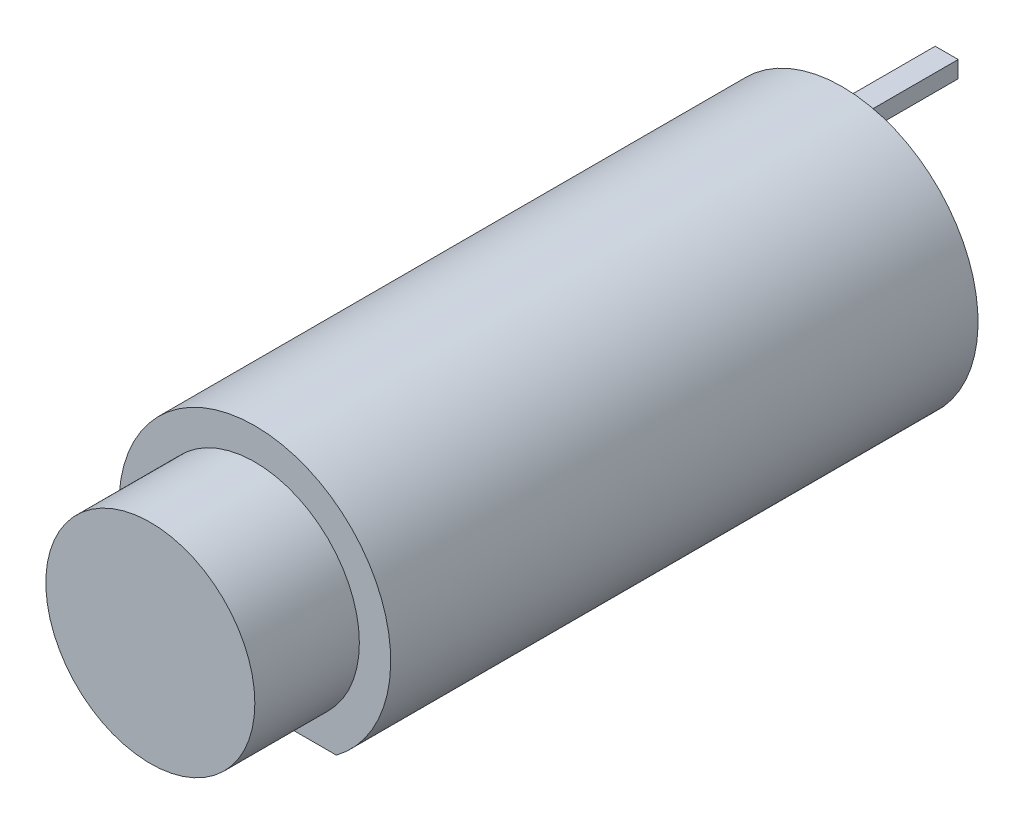
ISO-10303-21;
HEADER;
FILE_DESCRIPTION(('STEP AP214'),'2;1');
FILE_NAME('part.step','',(''),(''),'','','');
FILE_SCHEMA(('AUTOMOTIVE_DESIGN { 1 0 10303 214 1 1 1 1 }'));
ENDSEC;
DATA;
#1=APPLICATION_CONTEXT('core data for automotive mechanical design processes');
#2=APPLICATION_PROTOCOL_DEFINITION('international standard','automotive_design',2000,#1);
#3=PRODUCT_CONTEXT('',#1,'mechanical');
#4=PRODUCT('Part','Part','',(#3));
#5=PRODUCT_RELATED_PRODUCT_CATEGORY('part','',(#4));
#6=PRODUCT_DEFINITION_FORMATION('','',#4);
#7=PRODUCT_DEFINITION_CONTEXT('part definition',#1,'design');
#8=PRODUCT_DEFINITION('design','',#6,#7);
#9=PRODUCT_DEFINITION_SHAPE('','',#8);
#10=(LENGTH_UNIT() NAMED_UNIT(*) SI_UNIT(.MILLI.,.METRE.));
#11=(NAMED_UNIT(*) PLANE_ANGLE_UNIT() SI_UNIT($,.RADIAN.));
#12=(NAMED_UNIT(*) SI_UNIT($,.STERADIAN.) SOLID_ANGLE_UNIT());
#13=UNCERTAINTY_MEASURE_WITH_UNIT(LENGTH_MEASURE(1.E-05),#10,'distance_accuracy_value','');
#14=(GEOMETRIC_REPRESENTATION_CONTEXT(3) GLOBAL_UNCERTAINTY_ASSIGNED_CONTEXT((#13)) GLOBAL_UNIT_ASSIGNED_CONTEXT((#10,
#11,#12)) REPRESENTATION_CONTEXT('',''));
#15=CARTESIAN_POINT('',(0.,0.,0.));
#16=DIRECTION('',(0.,0.,1.));
#17=DIRECTION('',(1.,0.,0.));
#18=AXIS2_PLACEMENT_3D('',#15,#16,#17);
#19=CARTESIAN_POINT('',(0.,0.,33.1));
#20=DIRECTION('',(0.,0.,-1.));
#21=DIRECTION('',(-1.,0.,0.));
#22=AXIS2_PLACEMENT_3D('',#19,#20,#21);
#23=CYLINDRICAL_SURFACE('',#22,6.5);
#24=CARTESIAN_POINT('',(0.,0.,28.1));
#25=DIRECTION('',(0.,0.,1.));
#26=DIRECTION('',(1.,0.,0.));
#27=AXIS2_PLACEMENT_3D('',#24,#25,#26);
#28=CIRCLE('',#27,6.5);
#29=CARTESIAN_POINT('',(3.9,-5.2,28.1));
#30=VERTEX_POINT('',#29);
#31=CARTESIAN_POINT('',(-3.9,-5.2,28.1));
#32=VERTEX_POINT('',#31);
#33=EDGE_CURVE('E193',#30,#32,#28,.T.);
#34=ORIENTED_EDGE('',*,*,#33,.F.);
#35=DIRECTION('',(0.,0.,-1.));
#36=VECTOR('',#35,1.);
#37=CARTESIAN_POINT('',(3.9,-5.2,33.1));
#38=LINE('',#37,#36);
#39=CARTESIAN_POINT('',(3.9,-5.2,0.));
#40=VERTEX_POINT('',#39);
#41=EDGE_CURVE('E206',#30,#40,#38,.T.);
#42=ORIENTED_EDGE('',*,*,#41,.T.);
#43=CARTESIAN_POINT('',(0.,0.,0.));
#44=DIRECTION('',(0.,0.,1.));
#45=DIRECTION('',(1.,0.,0.));
#46=AXIS2_PLACEMENT_3D('',#43,#44,#45);
#47=CIRCLE('',#46,6.5);
#48=CARTESIAN_POINT('',(-3.9,-5.2,0.));
#49=VERTEX_POINT('',#48);
#50=EDGE_CURVE('E199',#40,#49,#47,.T.);
#51=ORIENTED_EDGE('',*,*,#50,.T.);
#52=DIRECTION('',(0.,0.,-1.));
#53=VECTOR('',#52,1.);
#54=CARTESIAN_POINT('',(-3.9,-5.2,33.1));
#55=LINE('',#54,#53);
#56=EDGE_CURVE('E42',#32,#49,#55,.T.);
#57=ORIENTED_EDGE('',*,*,#56,.F.);
#58=EDGE_LOOP('',(#34,#42,#51,#57));
#59=FACE_BOUND('',#58,.T.);
#60=ADVANCED_FACE('F35',(#59),#23,.T.);
#61=CARTESIAN_POINT('',(-3.9,-5.2,33.1));
#62=DIRECTION('',(0.,1.,0.));
#63=DIRECTION('',(0.,0.,1.));
#64=AXIS2_PLACEMENT_3D('',#61,#62,#63);
#65=PLANE('',#64);
#66=DIRECTION('',(1.,0.,0.));
#67=VECTOR('',#66,1.);
#68=CARTESIAN_POINT('',(-3.9,-5.2,28.1));
#69=LINE('',#68,#67);
#70=EDGE_CURVE('E197',#32,#30,#69,.T.);
#71=ORIENTED_EDGE('',*,*,#70,.F.);
#72=ORIENTED_EDGE('',*,*,#56,.T.);
#73=DIRECTION('',(1.,0.,0.));
#74=VECTOR('',#73,1.);
#75=CARTESIAN_POINT('',(-3.9,-5.2,0.));
#76=LINE('',#75,#74);
#77=CARTESIAN_POINT('',(-0.55,-5.2,0.));
#78=VERTEX_POINT('',#77);
#79=EDGE_CURVE('E203',#49,#78,#76,.T.);
#80=ORIENTED_EDGE('',*,*,#79,.T.);
#81=CARTESIAN_POINT('',(0.55,-5.2,0.));
#82=VERTEX_POINT('',#81);
#83=EDGE_CURVE('E207',#78,#82,#76,.T.);
#84=ORIENTED_EDGE('',*,*,#83,.T.);
#85=EDGE_CURVE('E202',#82,#40,#76,.T.);
#86=ORIENTED_EDGE('',*,*,#85,.T.);
#87=ORIENTED_EDGE('',*,*,#41,.F.);
#88=EDGE_LOOP('',(#71,#72,#80,#84,#86,#87));
#89=FACE_BOUND('',#88,.T.);
#90=ADVANCED_FACE('F213',(#89),#65,.F.);
#91=CARTESIAN_POINT('',(0.,0.,0.));
#92=DIRECTION('',(0.,0.,1.));
#93=DIRECTION('',(1.,0.,0.));
#94=AXIS2_PLACEMENT_3D('',#91,#92,#93);
#95=PLANE('',#94);
#96=DIRECTION('',(-1.,0.,0.));
#97=VECTOR('',#96,1.);
#98=CARTESIAN_POINT('',(-0.55,5.4,0.));
#99=LINE('',#98,#97);
#100=CARTESIAN_POINT('',(0.55,5.4,0.));
#101=VERTEX_POINT('',#100);
#102=CARTESIAN_POINT('',(-0.55,5.4,0.));
#103=VERTEX_POINT('',#102);
#104=EDGE_CURVE('E164',#101,#103,#99,.T.);
#105=ORIENTED_EDGE('',*,*,#104,.T.);
#106=DIRECTION('',(0.,-1.,0.));
#107=VECTOR('',#106,1.);
#108=CARTESIAN_POINT('',(-0.55,5.4,0.));
#109=LINE('',#108,#107);
#110=CARTESIAN_POINT('',(-0.55,4.6,0.));
#111=VERTEX_POINT('',#110);
#112=EDGE_CURVE('E156',#103,#111,#109,.T.);
#113=ORIENTED_EDGE('',*,*,#112,.T.);
#114=DIRECTION('',(1.,0.,0.));
#115=VECTOR('',#114,1.);
#116=CARTESIAN_POINT('',(-0.55,4.6,0.));
#117=LINE('',#116,#115);
#118=CARTESIAN_POINT('',(0.55,4.6,0.));
#119=VERTEX_POINT('',#118);
#120=EDGE_CURVE('E176',#111,#119,#117,.T.);
#121=ORIENTED_EDGE('',*,*,#120,.T.);
#122=DIRECTION('',(0.,1.,0.));
#123=VECTOR('',#122,1.);
#124=CARTESIAN_POINT('',(0.55,5.4,0.));
#125=LINE('',#124,#123);
#126=EDGE_CURVE('E57',#119,#101,#125,.T.);
#127=ORIENTED_EDGE('',*,*,#126,.T.);
#128=EDGE_LOOP('',(#105,#113,#121,#127));
#129=FACE_BOUND('',#128,.T.);
#130=DIRECTION('',(-1.,0.,0.));
#131=VECTOR('',#130,1.);
#132=CARTESIAN_POINT('',(-0.55,-4.6,0.));
#133=LINE('',#132,#131);
#134=CARTESIAN_POINT('',(0.55,-4.6,0.));
#135=VERTEX_POINT('',#134);
#136=CARTESIAN_POINT('',(-0.55,-4.6,0.));
#137=VERTEX_POINT('',#136);
#138=EDGE_CURVE('E49',#135,#137,#133,.T.);
#139=ORIENTED_EDGE('',*,*,#138,.T.);
#140=DIRECTION('',(0.,-1.,0.));
#141=VECTOR('',#140,1.);
#142=CARTESIAN_POINT('',(-0.55,-5.4,0.));
#143=LINE('',#142,#141);
#144=EDGE_CURVE('E143',#137,#78,#143,.T.);
#145=ORIENTED_EDGE('',*,*,#144,.T.);
#146=ORIENTED_EDGE('',*,*,#79,.F.);
#147=ORIENTED_EDGE('',*,*,#50,.F.);
#148=ORIENTED_EDGE('',*,*,#85,.F.);
#149=DIRECTION('',(0.,1.,0.));
#150=VECTOR('',#149,1.);
#151=CARTESIAN_POINT('',(0.55,0.,0.));
#152=LINE('',#151,#150);
#153=EDGE_CURVE('E11',#82,#135,#152,.T.);
#154=ORIENTED_EDGE('',*,*,#153,.T.);
#155=EDGE_LOOP('',(#139,#145,#146,#147,#148,#154));
#156=FACE_BOUND('',#155,.T.);
#157=ADVANCED_FACE('F220',(#129,#156),#95,.F.);
#158=CARTESIAN_POINT('',(0.,0.,28.1));
#159=DIRECTION('',(0.,0.,1.));
#160=DIRECTION('',(1.,0.,0.));
#161=AXIS2_PLACEMENT_3D('',#158,#159,#160);
#162=PLANE('',#161);
#163=CARTESIAN_POINT('',(0.,0.,28.1));
#164=DIRECTION('',(0.,0.,1.));
#165=DIRECTION('',(1.,0.,0.));
#166=AXIS2_PLACEMENT_3D('',#163,#164,#165);
#167=CIRCLE('',#166,5.);
#168=CARTESIAN_POINT('',(5.,0.,28.1));
#169=VERTEX_POINT('',#168);
#170=EDGE_CURVE('E190',#169,#169,#167,.T.);
#171=ORIENTED_EDGE('',*,*,#170,.F.);
#172=EDGE_LOOP('',(#171));
#173=FACE_BOUND('',#172,.T.);
#174=ORIENTED_EDGE('',*,*,#33,.T.);
#175=ORIENTED_EDGE('',*,*,#70,.T.);
#176=EDGE_LOOP('',(#174,#175));
#177=FACE_BOUND('',#176,.T.);
#178=ADVANCED_FACE('F244',(#173,#177),#162,.T.);
#179=CARTESIAN_POINT('',(0.,0.,28.1));
#180=DIRECTION('',(0.,0.,1.));
#181=DIRECTION('',(1.,0.,0.));
#182=AXIS2_PLACEMENT_3D('',#179,#180,#181);
#183=CYLINDRICAL_SURFACE('',#182,5.);
#184=ORIENTED_EDGE('',*,*,#170,.T.);
#185=EDGE_LOOP('',(#184));
#186=FACE_BOUND('',#185,.T.);
#187=CARTESIAN_POINT('',(0.,0.,33.1));
#188=DIRECTION('',(0.,0.,1.));
#189=DIRECTION('',(1.,0.,0.));
#190=AXIS2_PLACEMENT_3D('',#187,#188,#189);
#191=CIRCLE('',#190,5.);
#192=CARTESIAN_POINT('',(5.,0.,33.1));
#193=VERTEX_POINT('',#192);
#194=EDGE_CURVE('E184',#193,#193,#191,.T.);
#195=ORIENTED_EDGE('',*,*,#194,.F.);
#196=EDGE_LOOP('',(#195));
#197=FACE_BOUND('',#196,.T.);
#198=ADVANCED_FACE('F252',(#186,#197),#183,.T.);
#199=CARTESIAN_POINT('',(0.,0.,33.1));
#200=DIRECTION('',(0.,0.,1.));
#201=DIRECTION('',(1.,0.,0.));
#202=AXIS2_PLACEMENT_3D('',#199,#200,#201);
#203=PLANE('',#202);
#204=ORIENTED_EDGE('',*,*,#194,.T.);
#205=EDGE_LOOP('',(#204));
#206=FACE_BOUND('',#205,.T.);
#207=ADVANCED_FACE('F248',(#206),#203,.T.);
#208=CARTESIAN_POINT('',(-0.55,5.4,-5.));
#209=DIRECTION('',(-1.,0.,0.));
#210=DIRECTION('',(0.,0.,1.));
#211=AXIS2_PLACEMENT_3D('',#208,#209,#210);
#212=PLANE('',#211);
#213=ORIENTED_EDGE('',*,*,#112,.F.);
#214=DIRECTION('',(0.,0.,1.));
#215=VECTOR('',#214,1.);
#216=CARTESIAN_POINT('',(-0.55,5.4,-5.));
#217=LINE('',#216,#215);
#218=CARTESIAN_POINT('',(-0.55,5.4,-5.));
#219=VERTEX_POINT('',#218);
#220=EDGE_CURVE('E182',#219,#103,#217,.T.);
#221=ORIENTED_EDGE('',*,*,#220,.F.);
#222=DIRECTION('',(0.,-1.,0.));
#223=VECTOR('',#222,1.);
#224=CARTESIAN_POINT('',(-0.55,5.4,-5.));
#225=LINE('',#224,#223);
#226=CARTESIAN_POINT('',(-0.55,4.6,-5.));
#227=VERTEX_POINT('',#226);
#228=EDGE_CURVE('E160',#219,#227,#225,.T.);
#229=ORIENTED_EDGE('',*,*,#228,.T.);
#230=DIRECTION('',(0.,0.,1.));
#231=VECTOR('',#230,1.);
#232=CARTESIAN_POINT('',(-0.55,4.6,-5.));
#233=LINE('',#232,#231);
#234=EDGE_CURVE('E173',#227,#111,#233,.T.);
#235=ORIENTED_EDGE('',*,*,#234,.T.);
#236=EDGE_LOOP('',(#213,#221,#229,#235));
#237=FACE_BOUND('',#236,.T.);
#238=ADVANCED_FACE('F251',(#237),#212,.T.);
#239=CARTESIAN_POINT('',(-0.55,5.4,-5.));
#240=DIRECTION('',(0.,1.,0.));
#241=DIRECTION('',(0.,0.,1.));
#242=AXIS2_PLACEMENT_3D('',#239,#240,#241);
#243=PLANE('',#242);
#244=ORIENTED_EDGE('',*,*,#104,.F.);
#245=DIRECTION('',(0.,0.,1.));
#246=VECTOR('',#245,1.);
#247=CARTESIAN_POINT('',(0.55,5.4,-5.));
#248=LINE('',#247,#246);
#249=CARTESIAN_POINT('',(0.55,5.4,-5.));
#250=VERTEX_POINT('',#249);
#251=EDGE_CURVE('E185',#250,#101,#248,.T.);
#252=ORIENTED_EDGE('',*,*,#251,.F.);
#253=DIRECTION('',(-1.,0.,0.));
#254=VECTOR('',#253,1.);
#255=CARTESIAN_POINT('',(-0.55,5.4,-5.));
#256=LINE('',#255,#254);
#257=EDGE_CURVE('E170',#250,#219,#256,.T.);
#258=ORIENTED_EDGE('',*,*,#257,.T.);
#259=ORIENTED_EDGE('',*,*,#220,.T.);
#260=EDGE_LOOP('',(#244,#252,#258,#259));
#261=FACE_BOUND('',#260,.T.);
#262=ADVANCED_FACE('F262',(#261),#243,.T.);
#263=CARTESIAN_POINT('',(0.55,5.4,-5.));
#264=DIRECTION('',(1.,0.,0.));
#265=DIRECTION('',(0.,0.,-1.));
#266=AXIS2_PLACEMENT_3D('',#263,#264,#265);
#267=PLANE('',#266);
#268=ORIENTED_EDGE('',*,*,#126,.F.);
#269=DIRECTION('',(0.,0.,1.));
#270=VECTOR('',#269,1.);
#271=CARTESIAN_POINT('',(0.55,4.6,-5.));
#272=LINE('',#271,#270);
#273=CARTESIAN_POINT('',(0.55,4.6,-5.));
#274=VERTEX_POINT('',#273);
#275=EDGE_CURVE('E187',#274,#119,#272,.T.);
#276=ORIENTED_EDGE('',*,*,#275,.F.);
#277=DIRECTION('',(0.,1.,0.));
#278=VECTOR('',#277,1.);
#279=CARTESIAN_POINT('',(0.55,5.4,-5.));
#280=LINE('',#279,#278);
#281=EDGE_CURVE('E167',#274,#250,#280,.T.);
#282=ORIENTED_EDGE('',*,*,#281,.T.);
#283=ORIENTED_EDGE('',*,*,#251,.T.);
#284=EDGE_LOOP('',(#268,#276,#282,#283));
#285=FACE_BOUND('',#284,.T.);
#286=ADVANCED_FACE('F268',(#285),#267,.T.);
#287=CARTESIAN_POINT('',(-0.55,4.6,-5.));
#288=DIRECTION('',(0.,-1.,0.));
#289=DIRECTION('',(0.,0.,-1.));
#290=AXIS2_PLACEMENT_3D('',#287,#288,#289);
#291=PLANE('',#290);
#292=ORIENTED_EDGE('',*,*,#120,.F.);
#293=ORIENTED_EDGE('',*,*,#234,.F.);
#294=DIRECTION('',(1.,0.,0.));
#295=VECTOR('',#294,1.);
#296=CARTESIAN_POINT('',(-0.55,4.6,-5.));
#297=LINE('',#296,#295);
#298=EDGE_CURVE('E163',#227,#274,#297,.T.);
#299=ORIENTED_EDGE('',*,*,#298,.T.);
#300=ORIENTED_EDGE('',*,*,#275,.T.);
#301=EDGE_LOOP('',(#292,#293,#299,#300));
#302=FACE_BOUND('',#301,.T.);
#303=ADVANCED_FACE('F264',(#302),#291,.T.);
#304=CARTESIAN_POINT('',(0.,0.,-5.));
#305=DIRECTION('',(0.,0.,1.));
#306=DIRECTION('',(1.,0.,0.));
#307=AXIS2_PLACEMENT_3D('',#304,#305,#306);
#308=PLANE('',#307);
#309=ORIENTED_EDGE('',*,*,#228,.F.);
#310=ORIENTED_EDGE('',*,*,#257,.F.);
#311=ORIENTED_EDGE('',*,*,#281,.F.);
#312=ORIENTED_EDGE('',*,*,#298,.F.);
#313=EDGE_LOOP('',(#309,#310,#311,#312));
#314=FACE_BOUND('',#313,.T.);
#315=ADVANCED_FACE('F267',(#314),#308,.F.);
#316=CARTESIAN_POINT('',(0.,0.,0.));
#317=DIRECTION('',(0.,0.,1.));
#318=DIRECTION('',(1.,0.,0.));
#319=AXIS2_PLACEMENT_3D('',#316,#317,#318);
#320=PLANE('',#319);
#321=ORIENTED_EDGE('',*,*,#83,.F.);
#322=CARTESIAN_POINT('',(-0.55,-5.4,0.));
#323=VERTEX_POINT('',#322);
#324=EDGE_CURVE('E146',#78,#323,#143,.T.);
#325=ORIENTED_EDGE('',*,*,#324,.T.);
#326=DIRECTION('',(1.,0.,0.));
#327=VECTOR('',#326,1.);
#328=CARTESIAN_POINT('',(-0.55,-5.4,0.));
#329=LINE('',#328,#327);
#330=CARTESIAN_POINT('',(0.55,-5.4,0.));
#331=VERTEX_POINT('',#330);
#332=EDGE_CURVE('E151',#323,#331,#329,.T.);
#333=ORIENTED_EDGE('',*,*,#332,.T.);
#334=DIRECTION('',(0.,1.,0.));
#335=VECTOR('',#334,1.);
#336=CARTESIAN_POINT('',(0.55,-5.4,0.));
#337=LINE('',#336,#335);
#338=EDGE_CURVE('E122',#331,#82,#337,.T.);
#339=ORIENTED_EDGE('',*,*,#338,.T.);
#340=EDGE_LOOP('',(#321,#325,#333,#339));
#341=FACE_BOUND('',#340,.T.);
#342=ADVANCED_FACE('F224',(#341),#320,.T.);
#343=CARTESIAN_POINT('',(-0.55,-5.4,-5.));
#344=DIRECTION('',(0.,-1.,0.));
#345=DIRECTION('',(0.,0.,-1.));
#346=AXIS2_PLACEMENT_3D('',#343,#344,#345);
#347=PLANE('',#346);
#348=ORIENTED_EDGE('',*,*,#332,.F.);
#349=DIRECTION('',(0.,0.,1.));
#350=VECTOR('',#349,1.);
#351=CARTESIAN_POINT('',(-0.55,-5.4,-5.));
#352=LINE('',#351,#350);
#353=CARTESIAN_POINT('',(-0.55,-5.4,-5.));
#354=VERTEX_POINT('',#353);
#355=EDGE_CURVE('E142',#354,#323,#352,.T.);
#356=ORIENTED_EDGE('',*,*,#355,.F.);
#357=DIRECTION('',(1.,0.,0.));
#358=VECTOR('',#357,1.);
#359=CARTESIAN_POINT('',(-0.55,-5.4,-5.));
#360=LINE('',#359,#358);
#361=CARTESIAN_POINT('',(0.55,-5.4,-5.));
#362=VERTEX_POINT('',#361);
#363=EDGE_CURVE('E135',#354,#362,#360,.T.);
#364=ORIENTED_EDGE('',*,*,#363,.T.);
#365=DIRECTION('',(0.,0.,1.));
#366=VECTOR('',#365,1.);
#367=CARTESIAN_POINT('',(0.55,-5.4,-5.));
#368=LINE('',#367,#366);
#369=EDGE_CURVE('E117',#362,#331,#368,.T.);
#370=ORIENTED_EDGE('',*,*,#369,.T.);
#371=EDGE_LOOP('',(#348,#356,#364,#370));
#372=FACE_BOUND('',#371,.T.);
#373=ADVANCED_FACE('F140',(#372),#347,.T.);
#374=CARTESIAN_POINT('',(-0.55,-5.4,-5.));
#375=DIRECTION('',(-1.,0.,0.));
#376=DIRECTION('',(0.,0.,1.));
#377=AXIS2_PLACEMENT_3D('',#374,#375,#376);
#378=PLANE('',#377);
#379=ORIENTED_EDGE('',*,*,#144,.F.);
#380=DIRECTION('',(0.,0.,1.));
#381=VECTOR('',#380,1.);
#382=CARTESIAN_POINT('',(-0.55,-4.6,-5.));
#383=LINE('',#382,#381);
#384=CARTESIAN_POINT('',(-0.55,-4.6,-5.));
#385=VERTEX_POINT('',#384);
#386=EDGE_CURVE('E157',#385,#137,#383,.T.);
#387=ORIENTED_EDGE('',*,*,#386,.F.);
#388=DIRECTION('',(0.,-1.,0.));
#389=VECTOR('',#388,1.);
#390=CARTESIAN_POINT('',(-0.55,-5.4,-5.));
#391=LINE('',#390,#389);
#392=EDGE_CURVE('E128',#385,#354,#391,.T.);
#393=ORIENTED_EDGE('',*,*,#392,.T.);
#394=ORIENTED_EDGE('',*,*,#355,.T.);
#395=ORIENTED_EDGE('',*,*,#324,.F.);
#396=EDGE_LOOP('',(#379,#387,#393,#394,#395));
#397=FACE_BOUND('',#396,.T.);
#398=ADVANCED_FACE('F227',(#397),#378,.T.);
#399=CARTESIAN_POINT('',(-0.55,-4.6,-5.));
#400=DIRECTION('',(0.,1.,0.));
#401=DIRECTION('',(-1.,0.,0.));
#402=AXIS2_PLACEMENT_3D('',#399,#400,#401);
#403=PLANE('',#402);
#404=ORIENTED_EDGE('',*,*,#138,.F.);
#405=DIRECTION('',(0.,0.,1.));
#406=VECTOR('',#405,1.);
#407=CARTESIAN_POINT('',(0.55,-4.6,-5.));
#408=LINE('',#407,#406);
#409=CARTESIAN_POINT('',(0.55,-4.6,-5.));
#410=VERTEX_POINT('',#409);
#411=EDGE_CURVE('E127',#410,#135,#408,.T.);
#412=ORIENTED_EDGE('',*,*,#411,.F.);
#413=DIRECTION('',(-1.,0.,0.));
#414=VECTOR('',#413,1.);
#415=CARTESIAN_POINT('',(-0.55,-4.6,-5.));
#416=LINE('',#415,#414);
#417=EDGE_CURVE('E138',#410,#385,#416,.T.);
#418=ORIENTED_EDGE('',*,*,#417,.T.);
#419=ORIENTED_EDGE('',*,*,#386,.T.);
#420=EDGE_LOOP('',(#404,#412,#418,#419));
#421=FACE_BOUND('',#420,.T.);
#422=ADVANCED_FACE('F228',(#421),#403,.T.);
#423=CARTESIAN_POINT('',(0.55,-5.4,-5.));
#424=DIRECTION('',(1.,0.,0.));
#425=DIRECTION('',(0.,0.,-1.));
#426=AXIS2_PLACEMENT_3D('',#423,#424,#425);
#427=PLANE('',#426);
#428=ORIENTED_EDGE('',*,*,#338,.F.);
#429=ORIENTED_EDGE('',*,*,#369,.F.);
#430=DIRECTION('',(0.,1.,0.));
#431=VECTOR('',#430,1.);
#432=CARTESIAN_POINT('',(0.55,-5.4,-5.));
#433=LINE('',#432,#431);
#434=EDGE_CURVE('E120',#362,#410,#433,.T.);
#435=ORIENTED_EDGE('',*,*,#434,.T.);
#436=ORIENTED_EDGE('',*,*,#411,.T.);
#437=ORIENTED_EDGE('',*,*,#153,.F.);
#438=EDGE_LOOP('',(#428,#429,#435,#436,#437));
#439=FACE_BOUND('',#438,.T.);
#440=ADVANCED_FACE('F119',(#439),#427,.T.);
#441=CARTESIAN_POINT('',(0.,0.,-5.));
#442=DIRECTION('',(0.,0.,1.));
#443=DIRECTION('',(1.,0.,0.));
#444=AXIS2_PLACEMENT_3D('',#441,#442,#443);
#445=PLANE('',#444);
#446=ORIENTED_EDGE('',*,*,#363,.F.);
#447=ORIENTED_EDGE('',*,*,#392,.F.);
#448=ORIENTED_EDGE('',*,*,#417,.F.);
#449=ORIENTED_EDGE('',*,*,#434,.F.);
#450=EDGE_LOOP('',(#446,#447,#448,#449));
#451=FACE_BOUND('',#450,.T.);
#452=ADVANCED_FACE('F133',(#451),#445,.F.);
#453=CLOSED_SHELL('',(#60,#90,#157,#178,#198,#207,#238,#262,#286,#303,#315,#342,#373,#398,#422,
#440,#452));
#454=MANIFOLD_SOLID_BREP('B2',#453);
#455=ADVANCED_BREP_SHAPE_REPRESENTATION('',(#18,#454),#14);
#456=SHAPE_DEFINITION_REPRESENTATION(#9,#455);
ENDSEC;
END-ISO-10303-21;
